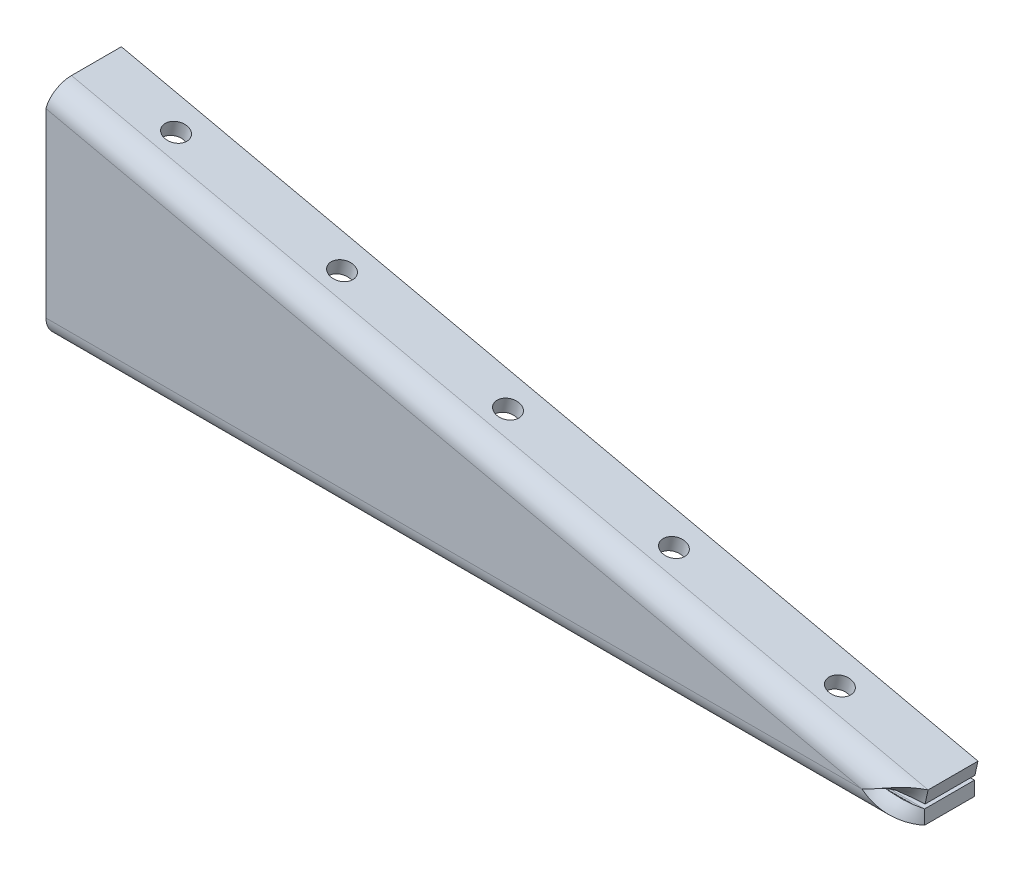
ISO-10303-21;
HEADER;
FILE_DESCRIPTION(('STEP AP214'),'2;1');
FILE_NAME('part.step','',(''),(''),'','','');
FILE_SCHEMA(('AUTOMOTIVE_DESIGN { 1 0 10303 214 1 1 1 1 }'));
ENDSEC;
DATA;
#1=APPLICATION_CONTEXT('core data for automotive mechanical design processes');
#2=APPLICATION_PROTOCOL_DEFINITION('international standard','automotive_design',2000,#1);
#3=PRODUCT_CONTEXT('',#1,'mechanical');
#4=PRODUCT('Part','Part','',(#3));
#5=PRODUCT_RELATED_PRODUCT_CATEGORY('part','',(#4));
#6=PRODUCT_DEFINITION_FORMATION('','',#4);
#7=PRODUCT_DEFINITION_CONTEXT('part definition',#1,'design');
#8=PRODUCT_DEFINITION('design','',#6,#7);
#9=PRODUCT_DEFINITION_SHAPE('','',#8);
#10=(LENGTH_UNIT() NAMED_UNIT(*) SI_UNIT(.MILLI.,.METRE.));
#11=(NAMED_UNIT(*) PLANE_ANGLE_UNIT() SI_UNIT($,.RADIAN.));
#12=(NAMED_UNIT(*) SI_UNIT($,.STERADIAN.) SOLID_ANGLE_UNIT());
#13=UNCERTAINTY_MEASURE_WITH_UNIT(LENGTH_MEASURE(1.E-05),#10,'distance_accuracy_value','');
#14=(GEOMETRIC_REPRESENTATION_CONTEXT(3) GLOBAL_UNCERTAINTY_ASSIGNED_CONTEXT((#13)) GLOBAL_UNIT_ASSIGNED_CONTEXT((#10,
#11,#12)) REPRESENTATION_CONTEXT('',''));
#15=CARTESIAN_POINT('',(0.,0.,0.));
#16=DIRECTION('',(0.,0.,1.));
#17=DIRECTION('',(1.,0.,0.));
#18=AXIS2_PLACEMENT_3D('',#15,#16,#17);
#19=CARTESIAN_POINT('',(0.,0.,-3.175));
#20=DIRECTION('',(-1.,0.,0.));
#21=DIRECTION('',(0.,0.,1.));
#22=AXIS2_PLACEMENT_3D('',#19,#20,#21);
#23=PLANE('',#22);
#24=DIRECTION('',(0.,-1.,0.));
#25=VECTOR('',#24,1.);
#26=CARTESIAN_POINT('',(0.,0.,0.));
#27=LINE('',#26,#25);
#28=CARTESIAN_POINT('',(0.,40.64,0.));
#29=VERTEX_POINT('',#28);
#30=CARTESIAN_POINT('',(0.,0.,0.));
#31=VERTEX_POINT('',#30);
#32=EDGE_CURVE('E188',#29,#31,#27,.T.);
#33=ORIENTED_EDGE('',*,*,#32,.F.);
#34=DIRECTION('',(0.,0.,1.));
#35=VECTOR('',#34,1.);
#36=CARTESIAN_POINT('',(0.,40.64,-3.175));
#37=LINE('',#36,#35);
#38=CARTESIAN_POINT('',(0.,40.6400000000002,-3.17500000000007));
#39=VERTEX_POINT('',#38);
#40=EDGE_CURVE('E87',#39,#29,#37,.T.);
#41=ORIENTED_EDGE('',*,*,#40,.F.);
#42=DIRECTION('',(0.,-1.,0.));
#43=VECTOR('',#42,1.);
#44=CARTESIAN_POINT('',(0.,0.,-3.175));
#45=LINE('',#44,#43);
#46=CARTESIAN_POINT('',(0.,0.,-3.17500000000001));
#47=VERTEX_POINT('',#46);
#48=EDGE_CURVE('E205',#39,#47,#45,.T.);
#49=ORIENTED_EDGE('',*,*,#48,.T.);
#50=DIRECTION('',(0.,0.,1.));
#51=VECTOR('',#50,1.);
#52=CARTESIAN_POINT('',(0.,0.,-3.175));
#53=LINE('',#52,#51);
#54=EDGE_CURVE('E13',#47,#31,#53,.T.);
#55=ORIENTED_EDGE('',*,*,#54,.T.);
#56=EDGE_LOOP('',(#33,#41,#49,#55));
#57=FACE_BOUND('',#56,.T.);
#58=ADVANCED_FACE('F79',(#57),#23,.T.);
#59=CARTESIAN_POINT('',(0.,0.,-3.175));
#60=DIRECTION('',(0.,0.,-1.));
#61=DIRECTION('',(-1.,0.,0.));
#62=AXIS2_PLACEMENT_3D('',#59,#60,#61);
#63=PLANE('',#62);
#64=DIRECTION('',(1.,0.,0.));
#65=VECTOR('',#64,1.);
#66=CARTESIAN_POINT('',(182.88,0.,-3.175));
#67=LINE('',#66,#65);
#68=CARTESIAN_POINT('',(182.88,0.,-3.17500000000001));
#69=VERTEX_POINT('',#68);
#70=EDGE_CURVE('E176',#47,#69,#67,.T.);
#71=ORIENTED_EDGE('',*,*,#70,.F.);
#72=ORIENTED_EDGE('',*,*,#48,.F.);
#73=DIRECTION('',(-0.976187060183953,0.216930457818656,0.));
#74=VECTOR('',#73,1.);
#75=CARTESIAN_POINT('',(0.,40.64,-3.175));
#76=LINE('',#75,#74);
#77=EDGE_CURVE('E187',#69,#39,#76,.T.);
#78=ORIENTED_EDGE('',*,*,#77,.F.);
#79=EDGE_LOOP('',(#71,#72,#78));
#80=FACE_BOUND('',#79,.T.);
#81=ADVANCED_FACE('F210',(#80),#63,.T.);
#82=CARTESIAN_POINT('',(0.,0.,0.));
#83=DIRECTION('',(0.,0.,-1.));
#84=DIRECTION('',(-1.,0.,0.));
#85=AXIS2_PLACEMENT_3D('',#82,#83,#84);
#86=PLANE('',#85);
#87=DIRECTION('',(1.,0.,0.));
#88=VECTOR('',#87,1.);
#89=CARTESIAN_POINT('',(182.88,0.,0.));
#90=LINE('',#89,#88);
#91=CARTESIAN_POINT('',(182.88,1.88983328422239E-13,-1.18930767162357E-13));
#92=VERTEX_POINT('',#91);
#93=EDGE_CURVE('E158',#31,#92,#90,.T.);
#94=ORIENTED_EDGE('',*,*,#93,.T.);
#95=DIRECTION('',(-0.976187060183953,0.216930457818656,0.));
#96=VECTOR('',#95,1.);
#97=CARTESIAN_POINT('',(0.,40.64,0.));
#98=LINE('',#97,#96);
#99=EDGE_CURVE('E215',#92,#29,#98,.T.);
#100=ORIENTED_EDGE('',*,*,#99,.T.);
#101=ORIENTED_EDGE('',*,*,#32,.T.);
#102=EDGE_LOOP('',(#94,#100,#101));
#103=FACE_BOUND('',#102,.T.);
#104=ADVANCED_FACE('F224',(#103),#86,.F.);
#105=CARTESIAN_POINT('',(0.,40.6400000000001,-4.69899999999999));
#106=DIRECTION('',(-0.976187060183953,0.216930457818657,0.));
#107=DIRECTION('',(-0.216930457818657,-0.976187060183953,0.));
#108=AXIS2_PLACEMENT_3D('',#105,#106,#107);
#109=PLANE('',#108);
#110=DIRECTION('',(-0.216930457818656,-0.976187060183953,0.));
#111=VECTOR('',#110,1.);
#112=CARTESIAN_POINT('',(1.01935622128986,45.2271029958044,-4.69899999999998));
#113=LINE('',#112,#111);
#114=CARTESIAN_POINT('',(0.330602017715675,42.1277090797204,-4.69899999999998));
#115=VERTEX_POINT('',#114);
#116=CARTESIAN_POINT('',(1.01935622128991,45.2271029958044,-4.69899999999997));
#117=VERTEX_POINT('',#116);
#118=EDGE_CURVE('E125',#115,#117,#113,.F.);
#119=ORIENTED_EDGE('',*,*,#118,.F.);
#120=CARTESIAN_POINT('',(0.,40.6400000000001,-4.69899999999999));
#121=DIRECTION('',(0.976187060183953,-0.216930457818657,0.));
#122=DIRECTION('',(0.216930457818657,0.976187060183953,0.));
#123=AXIS2_PLACEMENT_3D('',#120,#121,#122);
#124=CIRCLE('',#123,1.52399999999991);
#125=EDGE_CURVE('E207',#39,#115,#124,.F.);
#126=ORIENTED_EDGE('',*,*,#125,.F.);
#127=ORIENTED_EDGE('',*,*,#40,.T.);
#128=CARTESIAN_POINT('',(0.,40.6400000000001,-4.69899999999999));
#129=DIRECTION('',(0.976187060183953,-0.216930457818657,0.));
#130=DIRECTION('',(0.216930457818657,0.976187060183953,0.));
#131=AXIS2_PLACEMENT_3D('',#128,#129,#130);
#132=CIRCLE('',#131,4.69899999999991);
#133=EDGE_CURVE('E95',#29,#117,#132,.F.);
#134=ORIENTED_EDGE('',*,*,#133,.T.);
#135=EDGE_LOOP('',(#119,#126,#127,#134));
#136=FACE_BOUND('',#135,.T.);
#137=ADVANCED_FACE('F220',(#136),#109,.T.);
#138=CARTESIAN_POINT('',(192.985804399912,2.6004167935014,-4.69899999999997));
#139=CARTESIAN_POINT('',(192.229121189796,2.7685686179717,-4.07970301282514));
#140=CARTESIAN_POINT('',(191.445833915569,2.81650011497527,-3.46073619606739));
#141=CARTESIAN_POINT('',(189.829758255918,2.69011014756389,-2.31650450861049));
#142=CARTESIAN_POINT('',(188.997063481091,2.51595891135178,-1.79173310447883));
#143=CARTESIAN_POINT('',(187.293825003891,1.99733626496586,-0.915976085325001));
#144=CARTESIAN_POINT('',(186.423356049894,1.65320122248662,-0.56533504329329));
#145=CARTESIAN_POINT('',(184.661877239985,0.872497078916047,-0.0913787598515469));
#146=CARTESIAN_POINT('',(183.77102758907,0.436397880820885,0.031749999999844));
#147=CARTESIAN_POINT('',(182.88,1.89550612082388E-13,0.0317499999998803));
#148=CARTESIAN_POINT('',(192.978916857876,2.56942285434056,-4.69899999999997));
#149=CARTESIAN_POINT('',(192.222234090152,2.73757458050145,-4.08385948430097));
#150=CARTESIAN_POINT('',(191.439125637817,2.78631286509029,-3.4690466913958));
#151=CARTESIAN_POINT('',(189.823740015438,2.66302806540367,-2.33249441123727));
#152=CARTESIAN_POINT('',(188.9915557421,2.49117408588955,-1.81124496283803));
#153=CARTESIAN_POINT('',(187.289592287524,1.97828904131546,-0.941365507571142));
#154=CARTESIAN_POINT('',(186.419887352996,1.63759208644876,-0.593077761123537));
#155=CARTESIAN_POINT('',(184.660074440429,0.864384480912735,-0.122302392335765));
#156=CARTESIAN_POINT('',(183.770125481418,0.432340485459562,-1.55759036924761E-13));
#157=CARTESIAN_POINT('',(182.88,1.87671328316746E-13,-1.196959198424E-13));
#158=CARTESIAN_POINT('',(192.290162654302,-0.529971061743492,-4.69900000000002));
#159=CARTESIAN_POINT('',(191.533524125812,-0.361829166523568,-4.49950663188416));
#160=CARTESIAN_POINT('',(190.768297862595,-0.232412123407579,-4.30009622423651));
#161=CARTESIAN_POINT('',(189.221915967433,-0.0451801506185887,-3.93148467391484));
#162=CARTESIAN_POINT('',(188.440781842939,0.0126915396664578,-3.76243079875834));
#163=CARTESIAN_POINT('',(186.866320650849,0.0735666762757365,-3.48030773218531));
#164=CARTESIAN_POINT('',(186.073017663266,0.0766784826626479,-3.36734954414825));
#165=CARTESIAN_POINT('',(184.4797944848,0.0531246805815714,-3.21466564075763));
#166=CARTESIAN_POINT('',(183.679914716167,0.0266009493272822,-3.17500000000013));
#167=CARTESIAN_POINT('',(182.88,0.,-3.17500000000012));
#168=CARTESIAN_POINT('',(192.283206236846,-0.561274940295941,-4.69900000000002));
#169=CARTESIAN_POINT('',(191.526568155173,-0.39313314436852,-4.50370466807475));
#170=CARTESIAN_POINT('',(190.761522502065,-0.262901245791408,-4.30848982451821));
#171=CARTESIAN_POINT('',(189.215837544548,-0.0725330536004135,-3.94763447556789));
#172=CARTESIAN_POINT('',(188.435219026558,-0.0123411340503954,-3.78213777570114));
#173=CARTESIAN_POINT('',(186.862045607318,0.0543289803888353,-3.50595104865391));
#174=CARTESIAN_POINT('',(186.0695142794,0.0609132552644082,-3.3953696891568));
#175=CARTESIAN_POINT('',(184.477973657248,0.0449309565982266,-3.24589850956669));
#176=CARTESIAN_POINT('',(183.679003587438,0.0225029800123461,-3.20706750000013));
#177=CARTESIAN_POINT('',(182.88,0.,-3.20706750000012));
#178=B_SPLINE_SURFACE_WITH_KNOTS('',1,3,((#138,#139,#140,#141,#142,#143,#144,#145,#146,#147),
(#148,#149,#150,#151,#152,#153,#154,#155,#156,#157),(#158,#159,#160,#161,#162,#163,#164,#165,
#166,#167),(#168,#169,#170,#171,#172,#173,#174,#175,#176,#177)),.UNSPECIFIED.,.F.,.F.,.F.,(2,1,
1,2),(4,2,2,2,4),(-0.01,0.,1.,1.0101),(0.,0.25,0.5,0.75,1.),.UNSPECIFIED.);
#179=CARTESIAN_POINT('',(192.290162654302,-0.529971061743492,-4.69900000000002));
#180=CARTESIAN_POINT('',(192.049366426872,-0.476437271022111,-4.63551478110857));
#181=CARTESIAN_POINT('',(191.807701612998,-0.42681999215049,-4.57202802308309));
#182=CARTESIAN_POINT('',(191.322672146572,-0.335262442598152,-4.44604003774014));
#183=CARTESIAN_POINT('',(191.079307529192,-0.293322013548503,-4.38353879011648));
#184=CARTESIAN_POINT('',(190.59101856498,-0.216977575002203,-4.26053612667143));
#185=CARTESIAN_POINT('',(190.346094989904,-0.182570095917205,-4.2000338011193));
#186=CARTESIAN_POINT('',(189.85464566939,-0.120962283921681,-4.08193563772876));
#187=CARTESIAN_POINT('',(189.608119918306,-0.0937619764242041,-4.02433981013946));
#188=CARTESIAN_POINT('',(189.098052897696,-0.0446747231492071,-3.90945436898322));
#189=CARTESIAN_POINT('',(188.834413819381,-0.0232277946702167,-3.85241032676306));
#190=CARTESIAN_POINT('',(188.305547664036,0.0126117999617425,-3.74362419762509));
#191=CARTESIAN_POINT('',(188.040320473225,0.0270039544025378,-3.69188249552334));
#192=CARTESIAN_POINT('',(187.50845460038,0.0494779929350258,-3.59460943783821));
#193=CARTESIAN_POINT('',(187.241815873444,0.057559675054364,-3.54907828106741));
#194=CARTESIAN_POINT('',(186.707345605774,0.0682613505656633,-3.46502772542344));
#195=CARTESIAN_POINT('',(186.43951414906,0.0708817227579301,-3.42650784041268));
#196=CARTESIAN_POINT('',(185.898400252216,0.0716342364240752,-3.35658813565648));
#197=CARTESIAN_POINT('',(185.625101071065,0.0696912288581337,-3.32531698098039));
#198=CARTESIAN_POINT('',(185.077708648348,0.062242035714764,-3.27128821046229));
#199=CARTESIAN_POINT('',(184.803615400099,0.0567358200629206,-3.24853066647995));
#200=CARTESIAN_POINT('',(184.254739575791,0.0432983859087885,-3.21194223533375));
#201=CARTESIAN_POINT('',(183.979956700609,0.0353658170892231,-3.19811633218568));
#202=CARTESIAN_POINT('',(183.430116471854,0.0182887732553086,-3.17962955577701));
#203=CARTESIAN_POINT('',(183.155059114113,0.00914427955050532,-3.17496882388037));
#204=CARTESIAN_POINT('',(182.88,0.,-3.17500000000012));
#205=B_SPLINE_CURVE_WITH_KNOTS('',3,(#179,#180,#181,#182,#183,#184,#185,#186,#187,#188,#189,
#190,#191,#192,#193,#194,#195,#196,#197,#198,#199,#200,#201,#202,#203,#204),.UNSPECIFIED.,.F.,
.F.,(4,2,2,2,2,2,2,2,2,2,2,2,4),(0.,0.764108013834028,1.52820026278874,2.29193983595674,
3.05568210209409,3.86730551245854,4.67898778454466,5.49069603418878,6.30234798130269,
7.12745957363129,7.95257813020998,8.77815672093244,9.60374804531104),.UNSPECIFIED.);
#206=CARTESIAN_POINT('',(192.290162654302,-0.529971061743492,-4.69900000000003));
#207=VERTEX_POINT('',#206);
#208=EDGE_CURVE('E202',#207,#69,#205,.T.);
#209=DIRECTION('',(-0.216930457818656,-0.976187060183953,0.));
#210=VECTOR('',#209,1.);
#211=CARTESIAN_POINT('',(192.290162654302,-0.529971061743309,-4.69900000000002));
#212=LINE('',#211,#210);
#213=CARTESIAN_POINT('',(192.978916857876,2.56942285434075,-4.69900000000001));
#214=VERTEX_POINT('',#213);
#215=EDGE_CURVE('E233',#207,#214,#212,.F.);
#216=CARTESIAN_POINT('',(192.978916857876,2.56942285434056,-4.69899999999997));
#217=CARTESIAN_POINT('',(192.803778102758,2.60836213453007,-4.55662526144173));
#218=CARTESIAN_POINT('',(192.627229628719,2.64094781129493,-4.41425081592887));
#219=CARTESIAN_POINT('',(192.271363356149,2.69354191386425,-4.13068860663579));
#220=CARTESIAN_POINT('',(192.092045892854,2.71355185014911,-3.98950070234995));
#221=CARTESIAN_POINT('',(191.730657192682,2.7411331445314,-3.70946873745796));
#222=CARTESIAN_POINT('',(191.548586070893,2.7487050210349,-3.57062457940551));
#223=CARTESIAN_POINT('',(191.182350431555,2.75167731578617,-3.29689319249042));
#224=CARTESIAN_POINT('',(190.99819502184,2.74711861228578,-3.16199421897095));
#225=CARTESIAN_POINT('',(190.627283288722,2.72626690755505,-2.89676809778283));
#226=CARTESIAN_POINT('',(190.440527046642,2.70997427242208,-2.76644080761121));
#227=CARTESIAN_POINT('',(190.064512333277,2.66610725877461,-2.51142511152772));
#228=CARTESIAN_POINT('',(189.875253914289,2.63853311569391,-2.38673658800073));
#229=CARTESIAN_POINT('',(189.493616818633,2.57251359571346,-2.14354177876733));
#230=CARTESIAN_POINT('',(189.301228886511,2.53402646627823,-2.02506134870796));
#231=CARTESIAN_POINT('',(188.914176783548,2.44687415495541,-1.79579221113279));
#232=CARTESIAN_POINT('',(188.719512512561,2.39820852367157,-1.68500384352094));
#233=CARTESIAN_POINT('',(188.328075791177,2.29141816566433,-1.47203040297164));
#234=CARTESIAN_POINT('',(188.131303278583,2.23329315915912,-1.36984558463876));
#235=CARTESIAN_POINT('',(187.735892483947,2.1084060266791,-1.17495620287769));
#236=CARTESIAN_POINT('',(187.537254775411,2.04164647986729,-1.08224882325626));
#237=CARTESIAN_POINT('',(187.13826343687,1.90034214820781,-0.907042558976074));
#238=CARTESIAN_POINT('',(186.937909863875,1.82579762109874,-0.824543336551664));
#239=CARTESIAN_POINT('',(186.535699844893,1.66987656461839,-0.670446906251846));
#240=CARTESIAN_POINT('',(186.333843569924,1.58850080218278,-0.598848477088422));
#241=CARTESIAN_POINT('',(185.952969538076,1.42995871780771,-0.47498438404325));
#242=CARTESIAN_POINT('',(185.77409656302,1.35344628666614,-0.42143165781804));
#243=CARTESIAN_POINT('',(185.415511705514,1.19659899218178,-0.323575890166449));
#244=CARTESIAN_POINT('',(185.235799884095,1.11626440313681,-0.27927218620815));
#245=CARTESIAN_POINT('',(184.875695169284,0.952503906747726,-0.200195982052507));
#246=CARTESIAN_POINT('',(184.695302291853,0.869078071447212,-0.165423259887536));
#247=CARTESIAN_POINT('',(184.333564974486,0.699678854574789,-0.105557112030828));
#248=CARTESIAN_POINT('',(184.152219289233,0.613699823411884,-0.08048719039621));
#249=CARTESIAN_POINT('',(183.789163740078,0.440166993078012,-0.0403116489877436));
#250=CARTESIAN_POINT('',(183.607453853539,0.352613093149813,-0.02520666909871));
#251=CARTESIAN_POINT('',(183.243829576222,0.176706468015943,-0.00504435672705152));
#252=CARTESIAN_POINT('',(183.061915158694,0.0883536241243205,1.14574400644556E-05));
#253=CARTESIAN_POINT('',(182.88,1.87671328316746E-13,-1.196959198424E-13));
#254=B_SPLINE_CURVE_WITH_KNOTS('',3,(#216,#217,#218,#219,#220,#221,#222,#223,#224,#225,#226,
#227,#228,#229,#230,#231,#232,#233,#234,#235,#236,#237,#238,#239,#240,#241,#242,#243,#244,#245,
#246,#247,#248,#249,#250,#251,#252,#253),.UNSPECIFIED.,.F.,.F.,(4,2,2,2,2,2,2,2,2,2,2,2,2,2,2,2,
2,2,4),(0.,0.687032648661464,1.37398276160367,2.060904242416,2.74551383386202,3.43010206648934,
4.11467601317338,4.80190528844134,5.48916491232741,6.17644486712254,6.8635200014225,
7.55057239582179,8.23754775846006,8.84266202014231,9.44773292100583,10.0527897291381,
10.6593031873384,11.2658555881634,11.8724996252455),.UNSPECIFIED.);
#255=EDGE_CURVE('E204',#214,#92,#254,.T.);
#256=DIRECTION('',(0.,0.,1.));
#257=VECTOR('',#256,1.);
#258=CARTESIAN_POINT('',(182.88,0.,-3.175));
#259=LINE('',#258,#257);
#260=EDGE_CURVE('E82',#69,#92,#259,.T.);
#261=ORIENTED_EDGE('',*,*,#208,.F.);
#262=ORIENTED_EDGE('',*,*,#215,.T.);
#263=ORIENTED_EDGE('',*,*,#255,.T.);
#264=ORIENTED_EDGE('',*,*,#260,.F.);
#265=EDGE_LOOP('',(#261,#262,#263,#264));
#266=FACE_BOUND('',#265,.T.);
#267=ADVANCED_FACE('F200',(#266),#178,.F.);
#268=CARTESIAN_POINT('',(191.959560636586,-2.01768014146375,-4.69900000000004));
#269=DIRECTION('',(0.976187060183953,-0.216930457818657,0.));
#270=DIRECTION('',(0.216930457818657,0.976187060183953,0.));
#271=AXIS2_PLACEMENT_3D('',#268,#269,#270);
#272=CYLINDRICAL_SURFACE('',#271,4.69899999999991);
#273=ORIENTED_EDGE('',*,*,#99,.F.);
#274=ORIENTED_EDGE('',*,*,#255,.F.);
#275=DIRECTION('',(0.976187060183953,-0.216930457818656,0.));
#276=VECTOR('',#275,1.);
#277=CARTESIAN_POINT('',(1.01935622128986,45.2271029958044,-4.69899999999998));
#278=LINE('',#277,#276);
#279=EDGE_CURVE('E686',#214,#117,#278,.F.);
#280=ORIENTED_EDGE('',*,*,#279,.T.);
#281=ORIENTED_EDGE('',*,*,#133,.F.);
#282=EDGE_LOOP('',(#273,#274,#280,#281));
#283=FACE_BOUND('',#282,.T.);
#284=ADVANCED_FACE('F282',(#283),#272,.T.);
#285=CARTESIAN_POINT('',(191.959560636586,-2.01768014146375,-4.69900000000004));
#286=DIRECTION('',(0.976187060183953,-0.216930457818657,0.));
#287=DIRECTION('',(0.216930457818657,0.976187060183953,0.));
#288=AXIS2_PLACEMENT_3D('',#285,#286,#287);
#289=CYLINDRICAL_SURFACE('',#288,1.52399999999991);
#290=ORIENTED_EDGE('',*,*,#77,.T.);
#291=ORIENTED_EDGE('',*,*,#125,.T.);
#292=DIRECTION('',(0.976187060183953,-0.216930457818656,0.));
#293=VECTOR('',#292,1.);
#294=CARTESIAN_POINT('',(0.330602017715632,42.1277090797204,-4.69899999999999));
#295=LINE('',#294,#293);
#296=EDGE_CURVE('E117',#115,#207,#295,.T.);
#297=ORIENTED_EDGE('',*,*,#296,.T.);
#298=ORIENTED_EDGE('',*,*,#208,.T.);
#299=EDGE_LOOP('',(#290,#291,#297,#298));
#300=FACE_BOUND('',#299,.T.);
#301=ADVANCED_FACE('F206',(#300),#289,.F.);
#302=CARTESIAN_POINT('',(1.01935622128986,45.2271029958044,-3.17499999999999));
#303=DIRECTION('',(0.976187060183953,-0.216930457818656,0.));
#304=DIRECTION('',(0.216930457818656,0.976187060183953,0.));
#305=AXIS2_PLACEMENT_3D('',#302,#303,#304);
#306=PLANE('',#305);
#307=ORIENTED_EDGE('',*,*,#118,.T.);
#308=DIRECTION('',(0.,0.,1.));
#309=VECTOR('',#308,1.);
#310=CARTESIAN_POINT('',(1.01935622128986,45.2271029958044,1.38303950425521E-13));
#311=LINE('',#310,#309);
#312=CARTESIAN_POINT('',(1.01935622128987,45.2271029958044,-15.875));
#313=VERTEX_POINT('',#312);
#314=EDGE_CURVE('E690',#313,#117,#311,.T.);
#315=ORIENTED_EDGE('',*,*,#314,.F.);
#316=DIRECTION('',(-0.216930457818656,-0.976187060183953,0.));
#317=VECTOR('',#316,1.);
#318=CARTESIAN_POINT('',(1.01935622128987,45.2271029958044,-15.875));
#319=LINE('',#318,#317);
#320=CARTESIAN_POINT('',(0.330602017715641,42.1277090797204,-15.875));
#321=VERTEX_POINT('',#320);
#322=EDGE_CURVE('E208',#313,#321,#319,.T.);
#323=ORIENTED_EDGE('',*,*,#322,.T.);
#324=DIRECTION('',(0.,0.,-1.));
#325=VECTOR('',#324,1.);
#326=CARTESIAN_POINT('',(0.330602017715632,42.1277090797204,-3.175));
#327=LINE('',#326,#325);
#328=EDGE_CURVE('E704',#321,#115,#327,.F.);
#329=ORIENTED_EDGE('',*,*,#328,.T.);
#330=EDGE_LOOP('',(#307,#315,#323,#329));
#331=FACE_BOUND('',#330,.T.);
#332=ADVANCED_FACE('F303',(#331),#306,.F.);
#333=CARTESIAN_POINT('',(9.62547386834869,43.3146324075691,1.38042721478551E-13));
#334=DIRECTION('',(-0.216930457818656,-0.976187060183953,0.));
#335=DIRECTION('',(0.976187060183953,-0.216930457818656,0.));
#336=AXIS2_PLACEMENT_3D('',#333,#334,#335);
#337=PLANE('',#336);
#338=CARTESIAN_POINT('',(19.6157197177942,41.094577774359,-9.52500000000007));
#339=DIRECTION('',(0.216930457818656,0.976187060183953,0.));
#340=DIRECTION('',(-0.976187060183953,0.216930457818656,0.));
#341=AXIS2_PLACEMENT_3D('',#338,#339,#340);
#342=CIRCLE('',#341,2.47649999999999);
#343=CARTESIAN_POINT('',(17.1981924632486,41.6318060531469,-9.52500000000007));
#344=VERTEX_POINT('',#343);
#345=EDGE_CURVE('E612',#344,#344,#342,.T.);
#346=ORIENTED_EDGE('',*,*,#345,.F.);
#347=EDGE_LOOP('',(#346));
#348=FACE_BOUND('',#347,.T.);
#349=CARTESIAN_POINT('',(56.8084467108028,32.8295273314682,-9.5250000000001));
#350=DIRECTION('',(0.216930457818656,0.976187060183953,0.));
#351=DIRECTION('',(-0.976187060183953,0.216930457818656,0.));
#352=AXIS2_PLACEMENT_3D('',#349,#350,#351);
#353=CIRCLE('',#352,2.47649999999999);
#354=CARTESIAN_POINT('',(54.3909194562572,33.3667556102561,-9.5250000000001));
#355=VERTEX_POINT('',#354);
#356=EDGE_CURVE('E614',#355,#355,#353,.T.);
#357=ORIENTED_EDGE('',*,*,#356,.F.);
#358=EDGE_LOOP('',(#357));
#359=FACE_BOUND('',#358,.T.);
#360=CARTESIAN_POINT('',(94.0011737038114,24.5644768885774,-9.52500000000012));
#361=DIRECTION('',(0.216930457818656,0.976187060183953,0.));
#362=DIRECTION('',(-0.976187060183953,0.216930457818656,0.));
#363=AXIS2_PLACEMENT_3D('',#360,#361,#362);
#364=CIRCLE('',#363,2.47649999999999);
#365=CARTESIAN_POINT('',(91.5836464492658,25.1017051673653,-9.52500000000012));
#366=VERTEX_POINT('',#365);
#367=EDGE_CURVE('E622',#366,#366,#364,.T.);
#368=ORIENTED_EDGE('',*,*,#367,.F.);
#369=EDGE_LOOP('',(#368));
#370=FACE_BOUND('',#369,.T.);
#371=CARTESIAN_POINT('',(131.19390069682,16.2994264456866,-9.52500000000015));
#372=DIRECTION('',(0.216930457818656,0.976187060183953,0.));
#373=DIRECTION('',(-0.976187060183953,0.216930457818656,0.));
#374=AXIS2_PLACEMENT_3D('',#371,#372,#373);
#375=CIRCLE('',#374,2.47649999999999);
#376=CARTESIAN_POINT('',(128.776373442274,16.8366547244745,-9.52500000000015));
#377=VERTEX_POINT('',#376);
#378=EDGE_CURVE('E628',#377,#377,#375,.T.);
#379=ORIENTED_EDGE('',*,*,#378,.F.);
#380=EDGE_LOOP('',(#379));
#381=FACE_BOUND('',#380,.T.);
#382=CARTESIAN_POINT('',(168.386627689829,8.03437600279583,-9.52500000000018));
#383=DIRECTION('',(0.216930457818656,0.976187060183953,0.));
#384=DIRECTION('',(-0.976187060183953,0.216930457818656,0.));
#385=AXIS2_PLACEMENT_3D('',#382,#383,#384);
#386=CIRCLE('',#385,2.47649999999999);
#387=CARTESIAN_POINT('',(165.969100435283,8.57160428158373,-9.52500000000018));
#388=VERTEX_POINT('',#387);
#389=EDGE_CURVE('E634',#388,#388,#386,.T.);
#390=ORIENTED_EDGE('',*,*,#389,.F.);
#391=EDGE_LOOP('',(#390));
#392=FACE_BOUND('',#391,.T.);
#393=ORIENTED_EDGE('',*,*,#279,.F.);
#394=DIRECTION('',(0.,0.,-1.));
#395=VECTOR('',#394,1.);
#396=CARTESIAN_POINT('',(192.978916857876,2.56942285434074,0.));
#397=LINE('',#396,#395);
#398=CARTESIAN_POINT('',(192.978916857876,2.56942285434079,-15.875));
#399=VERTEX_POINT('',#398);
#400=EDGE_CURVE('E688',#214,#399,#397,.T.);
#401=ORIENTED_EDGE('',*,*,#400,.T.);
#402=DIRECTION('',(-0.976187060183953,0.216930457818656,0.));
#403=VECTOR('',#402,1.);
#404=CARTESIAN_POINT('',(9.6254738683487,43.3146324075691,-15.875));
#405=LINE('',#404,#403);
#406=EDGE_CURVE('E133',#399,#313,#405,.T.);
#407=ORIENTED_EDGE('',*,*,#406,.T.);
#408=ORIENTED_EDGE('',*,*,#314,.T.);
#409=EDGE_LOOP('',(#393,#401,#407,#408));
#410=FACE_BOUND('',#409,.T.);
#411=ADVANCED_FACE('F315',(#348,#359,#370,#381,#392,#410),#337,.F.);
#412=CARTESIAN_POINT('',(8.93671966477446,40.2152384914851,1.26957268227724E-13));
#413=DIRECTION('',(-0.216930457818656,-0.976187060183953,0.));
#414=DIRECTION('',(0.976187060183953,-0.216930457818656,0.));
#415=AXIS2_PLACEMENT_3D('',#412,#413,#414);
#416=PLANE('',#415);
#417=CARTESIAN_POINT('',(18.9269655142199,37.995183858275,-9.52500000000007));
#418=DIRECTION('',(0.216930457818656,0.976187060183953,0.));
#419=DIRECTION('',(-0.976187060183953,0.216930457818656,0.));
#420=AXIS2_PLACEMENT_3D('',#417,#418,#419);
#421=CIRCLE('',#420,2.47649999999999);
#422=CARTESIAN_POINT('',(16.5094382596744,38.5324121370629,-9.52500000000007));
#423=VERTEX_POINT('',#422);
#424=EDGE_CURVE('E609',#423,#423,#421,.T.);
#425=ORIENTED_EDGE('',*,*,#424,.T.);
#426=EDGE_LOOP('',(#425));
#427=FACE_BOUND('',#426,.T.);
#428=CARTESIAN_POINT('',(56.1196925072285,29.7301334153842,-9.5250000000001));
#429=DIRECTION('',(0.216930457818656,0.976187060183953,0.));
#430=DIRECTION('',(-0.976187060183953,0.216930457818656,0.));
#431=AXIS2_PLACEMENT_3D('',#428,#429,#430);
#432=CIRCLE('',#431,2.47649999999999);
#433=CARTESIAN_POINT('',(53.702165252683,30.2673616941721,-9.5250000000001));
#434=VERTEX_POINT('',#433);
#435=EDGE_CURVE('E619',#434,#434,#432,.T.);
#436=ORIENTED_EDGE('',*,*,#435,.T.);
#437=EDGE_LOOP('',(#436));
#438=FACE_BOUND('',#437,.T.);
#439=CARTESIAN_POINT('',(93.3124195002372,21.4650829724934,-9.52500000000012));
#440=DIRECTION('',(0.216930457818656,0.976187060183953,0.));
#441=DIRECTION('',(-0.976187060183953,0.216930457818656,0.));
#442=AXIS2_PLACEMENT_3D('',#439,#440,#441);
#443=CIRCLE('',#442,2.47649999999999);
#444=CARTESIAN_POINT('',(90.8948922456916,22.0023112512813,-9.52500000000012));
#445=VERTEX_POINT('',#444);
#446=EDGE_CURVE('E625',#445,#445,#443,.T.);
#447=ORIENTED_EDGE('',*,*,#446,.T.);
#448=EDGE_LOOP('',(#447));
#449=FACE_BOUND('',#448,.T.);
#450=CARTESIAN_POINT('',(130.505146493246,13.2000325296026,-9.52500000000015));
#451=DIRECTION('',(0.216930457818656,0.976187060183953,0.));
#452=DIRECTION('',(-0.976187060183953,0.216930457818656,0.));
#453=AXIS2_PLACEMENT_3D('',#450,#451,#452);
#454=CIRCLE('',#453,2.47649999999999);
#455=CARTESIAN_POINT('',(128.0876192387,13.7372608083905,-9.52500000000015));
#456=VERTEX_POINT('',#455);
#457=EDGE_CURVE('E631',#456,#456,#454,.T.);
#458=ORIENTED_EDGE('',*,*,#457,.T.);
#459=EDGE_LOOP('',(#458));
#460=FACE_BOUND('',#459,.T.);
#461=CARTESIAN_POINT('',(167.697873486254,4.93498208671178,-9.52500000000018));
#462=DIRECTION('',(0.216930457818656,0.976187060183953,0.));
#463=DIRECTION('',(-0.976187060183953,0.216930457818656,0.));
#464=AXIS2_PLACEMENT_3D('',#461,#462,#463);
#465=CIRCLE('',#464,2.47649999999999);
#466=CARTESIAN_POINT('',(165.280346231709,5.47221036549968,-9.52500000000018));
#467=VERTEX_POINT('',#466);
#468=EDGE_CURVE('E637',#467,#467,#465,.T.);
#469=ORIENTED_EDGE('',*,*,#468,.T.);
#470=EDGE_LOOP('',(#469));
#471=FACE_BOUND('',#470,.T.);
#472=DIRECTION('',(0.976187060183953,-0.216930457818656,0.));
#473=VECTOR('',#472,1.);
#474=CARTESIAN_POINT('',(0.330602017715641,42.1277090797204,-15.875));
#475=LINE('',#474,#473);
#476=CARTESIAN_POINT('',(192.290162654302,-0.529971061743266,-15.875));
#477=VERTEX_POINT('',#476);
#478=EDGE_CURVE('E152',#477,#321,#475,.F.);
#479=ORIENTED_EDGE('',*,*,#478,.F.);
#480=DIRECTION('',(0.,0.,1.));
#481=VECTOR('',#480,1.);
#482=CARTESIAN_POINT('',(192.290162654302,-0.529971061743263,-15.875));
#483=LINE('',#482,#481);
#484=EDGE_CURVE('E697',#207,#477,#483,.F.);
#485=ORIENTED_EDGE('',*,*,#484,.F.);
#486=ORIENTED_EDGE('',*,*,#296,.F.);
#487=ORIENTED_EDGE('',*,*,#328,.F.);
#488=EDGE_LOOP('',(#479,#485,#486,#487));
#489=FACE_BOUND('',#488,.T.);
#490=ADVANCED_FACE('F311',(#427,#438,#449,#460,#471,#489),#416,.T.);
#491=CARTESIAN_POINT('',(1.01935622128987,45.2271029958044,-15.875));
#492=DIRECTION('',(0.,0.,1.));
#493=DIRECTION('',(0.,-1.,0.));
#494=AXIS2_PLACEMENT_3D('',#491,#492,#493);
#495=PLANE('',#494);
#496=ORIENTED_EDGE('',*,*,#478,.T.);
#497=ORIENTED_EDGE('',*,*,#322,.F.);
#498=ORIENTED_EDGE('',*,*,#406,.F.);
#499=DIRECTION('',(-0.216930457818656,-0.976187060183953,0.));
#500=VECTOR('',#499,1.);
#501=CARTESIAN_POINT('',(192.978916857876,2.56942285434078,-15.875));
#502=LINE('',#501,#500);
#503=EDGE_CURVE('E694',#399,#477,#502,.T.);
#504=ORIENTED_EDGE('',*,*,#503,.T.);
#505=EDGE_LOOP('',(#496,#497,#498,#504));
#506=FACE_BOUND('',#505,.T.);
#507=ADVANCED_FACE('F307',(#506),#495,.F.);
#508=CARTESIAN_POINT('',(192.978916857876,2.56942285434077,-15.875));
#509=DIRECTION('',(-0.976187060183953,0.216930457818656,0.));
#510=DIRECTION('',(-0.216930457818656,-0.976187060183953,0.));
#511=AXIS2_PLACEMENT_3D('',#508,#509,#510);
#512=PLANE('',#511);
#513=ORIENTED_EDGE('',*,*,#215,.F.);
#514=ORIENTED_EDGE('',*,*,#484,.T.);
#515=ORIENTED_EDGE('',*,*,#503,.F.);
#516=ORIENTED_EDGE('',*,*,#400,.F.);
#517=EDGE_LOOP('',(#513,#514,#515,#516));
#518=FACE_BOUND('',#517,.T.);
#519=ADVANCED_FACE('F310',(#518),#512,.F.);
#520=CARTESIAN_POINT('',(182.88,0.,0.0317499999999931));
#521=CARTESIAN_POINT('',(183.655141610639,-0.619296987174863,0.0317499999999955));
#522=CARTESIAN_POINT('',(184.430174313735,-1.23826380393265,-0.0913787598513678));
#523=CARTESIAN_POINT('',(185.98034862747,-2.38249549138962,-0.565335043293091));
#524=CARTESIAN_POINT('',(186.755435784337,-2.90726689552132,-0.915976085324803));
#525=CARTESIAN_POINT('',(188.305610098072,-3.78302391467518,-1.79173310447866));
#526=CARTESIAN_POINT('',(189.08069725494,-4.1336649567069,-2.31650450861036));
#527=CARTESIAN_POINT('',(190.630871568675,-4.60762124014863,-3.46073619606732));
#528=CARTESIAN_POINT('',(191.40590427177,-4.73075,-4.07970301282503));
#529=CARTESIAN_POINT('',(192.18104588241,-4.73075,-4.69899999999998));
#530=CARTESIAN_POINT('',(182.88,0.,0.));
#531=CARTESIAN_POINT('',(183.655141157455,-0.615140515699032,0.));
#532=CARTESIAN_POINT('',(184.430174313735,-1.22995330860424,-0.122302392335587));
#533=CARTESIAN_POINT('',(185.98034862747,-2.36650558876284,-0.593077761123339));
#534=CARTESIAN_POINT('',(186.755435784337,-2.88775503716211,-0.941365507570946));
#535=CARTESIAN_POINT('',(188.305610098072,-3.75763449242904,-1.81124496283786));
#536=CARTESIAN_POINT('',(189.08069725494,-4.10592223887665,-2.33249441123713));
#537=CARTESIAN_POINT('',(190.630871568675,-4.57669760766441,-3.46904669139573));
#538=CARTESIAN_POINT('',(191.405904724954,-4.699,-4.08385948430086));
#539=CARTESIAN_POINT('',(192.18104588241,-4.699,-4.69899999999998));
#540=CARTESIAN_POINT('',(182.88,0.,-3.17500000000001));
#541=CARTESIAN_POINT('',(183.655095839057,-0.199493368115881,-3.17500000000001));
#542=CARTESIAN_POINT('',(184.430174313735,-0.398903775763542,-3.21466564075749));
#543=CARTESIAN_POINT('',(185.98034862747,-0.767515326085249,-3.36734954414811));
#544=CARTESIAN_POINT('',(186.755435784337,-0.936569201241768,-3.48030773218517));
#545=CARTESIAN_POINT('',(188.305610098072,-1.21869226781482,-3.76243079875823));
#546=CARTESIAN_POINT('',(189.08069725494,-1.33165045585189,-3.93148467391475));
#547=CARTESIAN_POINT('',(190.630871568675,-1.48433435924251,-4.30009622423645));
#548=CARTESIAN_POINT('',(191.405950043353,-1.524,-4.49950663188411));
#549=CARTESIAN_POINT('',(192.18104588241,-1.524,-4.69899999999999));
#550=CARTESIAN_POINT('',(182.88,0.,-3.20706750000001));
#551=CARTESIAN_POINT('',(183.655095381341,-0.195295331925291,-3.20706750000001));
#552=CARTESIAN_POINT('',(184.430174313735,-0.39051017548185,-3.24589850956655));
#553=CARTESIAN_POINT('',(185.98034862747,-0.751365524432205,-3.39536968915666));
#554=CARTESIAN_POINT('',(186.755435784337,-0.916862224298973,-3.50595104865378));
#555=CARTESIAN_POINT('',(188.305610098072,-1.19304895134622,-3.78213777570102));
#556=CARTESIAN_POINT('',(189.08069725494,-1.30363031084334,-3.94763447556779));
#557=CARTESIAN_POINT('',(190.630871568675,-1.45310149043345,-4.30848982451815));
#558=CARTESIAN_POINT('',(191.405950501069,-1.4919325,-4.5037046680747));
#559=CARTESIAN_POINT('',(192.18104588241,-1.4919325,-4.69899999999999));
#560=B_SPLINE_SURFACE_WITH_KNOTS('',1,3,((#520,#521,#522,#523,#524,#525,#526,#527,#528,#529),
(#530,#531,#532,#533,#534,#535,#536,#537,#538,#539),(#540,#541,#542,#543,#544,#545,#546,#547,
#548,#549),(#550,#551,#552,#553,#554,#555,#556,#557,#558,#559)),.UNSPECIFIED.,.F.,.F.,.F.,(2,1,
1,2),(4,2,2,2,4),(-0.01,0.,1.,1.0101),(0.,0.25,0.5,0.75,1.),.UNSPECIFIED.);
#561=DIRECTION('',(0.,1.,0.));
#562=VECTOR('',#561,1.);
#563=CARTESIAN_POINT('',(192.18104588241,-4.699,-4.69899999999998));
#564=LINE('',#563,#562);
#565=CARTESIAN_POINT('',(192.18104588241,-1.524,-4.69899999999999));
#566=VERTEX_POINT('',#565);
#567=CARTESIAN_POINT('',(192.18104588241,-4.699,-4.69899999999998));
#568=VERTEX_POINT('',#567);
#569=EDGE_CURVE('E195',#566,#568,#564,.F.);
#570=CARTESIAN_POINT('',(182.88,0.,-3.17500000000001));
#571=CARTESIAN_POINT('',(183.126675271088,-0.0634852188914716,-3.17497704207257));
#572=CARTESIAN_POINT('',(183.373348834315,-0.126971976916963,-3.17896575518885));
#573=CARTESIAN_POINT('',(183.86668994439,-0.252959962259926,-3.19480612426118));
#574=CARTESIAN_POINT('',(184.113357491257,-0.315461209883587,-3.20665761798932));
#575=CARTESIAN_POINT('',(184.606580293757,-0.438463873328661,-3.23805591351785));
#576=CARTESIAN_POINT('',(184.85313554867,-0.4989661988808,-3.25759916093323));
#577=CARTESIAN_POINT('',(185.346246626954,-0.617064362271372,-3.30406873815071));
#578=CARTESIAN_POINT('',(185.592802450323,-0.674660189860688,-3.33099509398554));
#579=CARTESIAN_POINT('',(186.101371795995,-0.789545631016936,-3.39372582481771));
#580=CARTESIAN_POINT('',(186.363385344818,-0.846589673237096,-3.42998095671347));
#581=CARTESIAN_POINT('',(186.887432341907,-0.955375802375067,-3.50972198539535));
#582=CARTESIAN_POINT('',(187.149465790238,-1.00711750447681,-3.55320840639072));
#583=CARTESIAN_POINT('',(187.67354167653,-1.10439056216194,-3.64664744807959));
#584=CARTESIAN_POINT('',(187.935584114511,-1.14992171893274,-3.69660027567662));
#585=CARTESIAN_POINT('',(188.459648593231,-1.23397227457671,-3.80209631837627));
#586=CARTESIAN_POINT('',(188.721670634125,-1.27249215958748,-3.85763914547244));
#587=CARTESIAN_POINT('',(189.250062261444,-1.34241186434367,-3.97428863674346));
#588=CARTESIAN_POINT('',(189.516431888121,-1.37368301901976,-4.03547229207564));
#589=CARTESIAN_POINT('',(190.049173331142,-1.42771178953786,-4.16149018689754));
#590=CARTESIAN_POINT('',(190.315545147484,-1.4504693335202,-4.22632445719518));
#591=CARTESIAN_POINT('',(190.848435636078,-1.48705776466639,-4.35850979039112));
#592=CARTESIAN_POINT('',(191.114954307406,-1.50088366781446,-4.42586223634091));
#593=CARTESIAN_POINT('',(191.647996692948,-1.51937044422312,-4.56180971810873));
#594=CARTESIAN_POINT('',(191.914520407176,-1.52403117611976,-4.63040477307634));
#595=CARTESIAN_POINT('',(192.18104588241,-1.524,-4.69899999999999));
#596=B_SPLINE_CURVE_WITH_KNOTS('',3,(#570,#571,#572,#573,#574,#575,#576,#577,#578,#579,#580,
#581,#582,#583,#584,#585,#586,#587,#588,#589,#590,#591,#592,#593,#594,#595),.UNSPECIFIED.,.F.,
.F.,(4,2,2,2,2,2,2,2,2,2,2,2,4),(0.,0.764108013834023,1.5282002627888,2.29193983595682,
3.05568210209421,3.86730551245861,4.67898778454462,5.49069603418866,6.3023479813025,
7.12745957363104,7.95257813020966,8.77815672093202,9.60374804531056),.UNSPECIFIED.);
#597=EDGE_CURVE('E179',#69,#566,#596,.T.);
#598=CARTESIAN_POINT('',(182.88,0.,0.));
#599=CARTESIAN_POINT('',(183.059415302361,-0.142374738558234,1.90911243758449E-05));
#600=CARTESIAN_POINT('',(183.238828463993,-0.284749184071082,-0.00646993417095865));
#601=CARTESIAN_POINT('',(183.597629777181,-0.568311393364143,-0.0323264852317411));
#602=CARTESIAN_POINT('',(183.777017929153,-0.709499297649968,-0.0516924637626556));
#603=CARTESIAN_POINT('',(184.135784124775,-0.989531262541948,-0.103164177262369));
#604=CARTESIAN_POINT('',(184.315162168535,-1.1283754205944,-0.135269381203565));
#605=CARTESIAN_POINT('',(184.673321441896,-1.40210680750946,-0.211815530439479));
#606=CARTESIAN_POINT('',(184.852102648285,-1.5370057810289,-0.256214595146948));
#607=CARTESIAN_POINT('',(185.209658512772,-1.80223190221701,-0.357031811563556));
#608=CARTESIAN_POINT('',(185.388433170901,-1.93255919238866,-0.413449588251532));
#609=CARTESIAN_POINT('',(185.745977777173,-2.18757488847216,-0.537841043259927));
#610=CARTESIAN_POINT('',(185.924747725337,-2.31226341199913,-0.605814480407965));
#611=CARTESIAN_POINT('',(186.282975275108,-2.55545822123251,-0.75305059141372));
#612=CARTESIAN_POINT('',(186.462432854373,-2.67393865129187,-0.832356031346015));
#613=CARTESIAN_POINT('',(186.821362118107,-2.90320778886704,-1.00139637981991));
#614=CARTESIAN_POINT('',(187.00083380285,-3.0139961564789,-1.09113174878088));
#615=CARTESIAN_POINT('',(187.359783183893,-3.2269695970282,-1.28029366159697));
#616=CARTESIAN_POINT('',(187.539260880215,-3.32915441536108,-1.37972049206345));
#617=CARTESIAN_POINT('',(187.898163958571,-3.52404379712215,-1.58741033948067));
#618=CARTESIAN_POINT('',(188.077589340255,-3.61675117674359,-1.69567071427507));
#619=CARTESIAN_POINT('',(188.436426308705,-3.79195744102378,-1.92016354812422));
#620=CARTESIAN_POINT('',(188.615837895731,-3.87445666344819,-2.03639574321093));
#621=CARTESIAN_POINT('',(188.974646085572,-4.02855309374802,-2.27585546451436));
#622=CARTESIAN_POINT('',(189.154042687812,-4.10015152291145,-2.39908220495906));
#623=CARTESIAN_POINT('',(189.491454382316,-4.22401561595666,-2.63647211432082));
#624=CARTESIAN_POINT('',(189.649469989266,-4.27756834218191,-2.74996555591466));
#625=CARTESIAN_POINT('',(189.965490931742,-4.37542410983355,-2.98086583252096));
#626=CARTESIAN_POINT('',(190.123496267192,-4.41972781379188,-3.09827238652768));
#627=CARTESIAN_POINT('',(190.439501190647,-4.49880401794756,-3.33625094471855));
#628=CARTESIAN_POINT('',(190.5975007787,-4.53357674011254,-3.45682287511238));
#629=CARTESIAN_POINT('',(190.913876217429,-4.59344288796928,-3.70066004049524));
#630=CARTESIAN_POINT('',(191.0722520582,-4.61851280960391,-3.82393106068889));
#631=CARTESIAN_POINT('',(191.389017631082,-4.65868835101239,-4.07208937066992));
#632=CARTESIAN_POINT('',(191.547407363434,-4.67379333090142,-4.1969767637255));
#633=CARTESIAN_POINT('',(191.864213172996,-4.69395564327308,-4.44757571593438));
#634=CARTESIAN_POINT('',(192.022629250573,-4.69901145744019,-4.57328739674994));
#635=CARTESIAN_POINT('',(192.18104588241,-4.699,-4.69899999999998));
#636=B_SPLINE_CURVE_WITH_KNOTS('',3,(#598,#599,#600,#601,#602,#603,#604,#605,#606,#607,#608,
#609,#610,#611,#612,#613,#614,#615,#616,#617,#618,#619,#620,#621,#622,#623,#624,#625,#626,#627,
#628,#629,#630,#631,#632,#633,#634,#635),.UNSPECIFIED.,.F.,.F.,(4,2,2,2,2,2,2,2,2,2,2,2,2,2,2,2,
2,2,4),(0.,0.687032648661358,1.37398276160349,2.06090424241575,2.74551383386166,
3.43010206648889,4.11467601317287,4.8019052884407,5.48916491232666,6.1764448671217,
6.86352000142156,7.55057239582074,8.23754775845894,8.84266202014133,9.44773292100502,
10.0527897291375,10.659303187338,11.2658555881631,11.8724996252454),.UNSPECIFIED.);
#637=EDGE_CURVE('E104',#92,#568,#636,.T.);
#638=ORIENTED_EDGE('',*,*,#569,.F.);
#639=ORIENTED_EDGE('',*,*,#597,.F.);
#640=ORIENTED_EDGE('',*,*,#260,.T.);
#641=ORIENTED_EDGE('',*,*,#637,.T.);
#642=EDGE_LOOP('',(#638,#639,#640,#641));
#643=FACE_BOUND('',#642,.T.);
#644=ADVANCED_FACE('F193',(#643),#560,.F.);
#645=CARTESIAN_POINT('',(0.,0.,-4.699));
#646=DIRECTION('',(1.,0.,0.));
#647=DIRECTION('',(0.,1.,0.));
#648=AXIS2_PLACEMENT_3D('',#645,#646,#647);
#649=PLANE('',#648);
#650=CARTESIAN_POINT('',(0.,0.,-4.699));
#651=DIRECTION('',(-1.,0.,0.));
#652=DIRECTION('',(0.,-1.,0.));
#653=AXIS2_PLACEMENT_3D('',#650,#651,#652);
#654=CIRCLE('',#653,1.52399999999999);
#655=CARTESIAN_POINT('',(0.,-1.52399999999999,-4.69899999999999));
#656=VERTEX_POINT('',#655);
#657=EDGE_CURVE('E182',#656,#47,#654,.T.);
#658=ORIENTED_EDGE('',*,*,#657,.F.);
#659=DIRECTION('',(0.,1.,0.));
#660=VECTOR('',#659,1.);
#661=CARTESIAN_POINT('',(0.,-1.524,-4.69899999999999));
#662=LINE('',#661,#660);
#663=CARTESIAN_POINT('',(0.,-4.699,-4.69899999999998));
#664=VERTEX_POINT('',#663);
#665=EDGE_CURVE('E230',#656,#664,#662,.F.);
#666=ORIENTED_EDGE('',*,*,#665,.T.);
#667=CARTESIAN_POINT('',(0.,0.,-4.699));
#668=DIRECTION('',(-1.,0.,0.));
#669=DIRECTION('',(0.,-1.,0.));
#670=AXIS2_PLACEMENT_3D('',#667,#668,#669);
#671=CIRCLE('',#670,4.69899999999999);
#672=EDGE_CURVE('E196',#664,#31,#671,.T.);
#673=ORIENTED_EDGE('',*,*,#672,.T.);
#674=ORIENTED_EDGE('',*,*,#54,.F.);
#675=EDGE_LOOP('',(#658,#666,#673,#674));
#676=FACE_BOUND('',#675,.T.);
#677=ADVANCED_FACE('F226',(#676),#649,.F.);
#678=CARTESIAN_POINT('',(0.,0.,-4.699));
#679=DIRECTION('',(-1.,0.,0.));
#680=DIRECTION('',(0.,-1.,0.));
#681=AXIS2_PLACEMENT_3D('',#678,#679,#680);
#682=CYLINDRICAL_SURFACE('',#681,4.69899999999999);
#683=ORIENTED_EDGE('',*,*,#93,.F.);
#684=ORIENTED_EDGE('',*,*,#672,.F.);
#685=DIRECTION('',(-1.,0.,0.));
#686=VECTOR('',#685,1.);
#687=CARTESIAN_POINT('',(182.88,-4.699,-4.69899999999998));
#688=LINE('',#687,#686);
#689=EDGE_CURVE('E654',#664,#568,#688,.F.);
#690=ORIENTED_EDGE('',*,*,#689,.T.);
#691=ORIENTED_EDGE('',*,*,#637,.F.);
#692=EDGE_LOOP('',(#683,#684,#690,#691));
#693=FACE_BOUND('',#692,.T.);
#694=ADVANCED_FACE('F255',(#693),#682,.T.);
#695=CARTESIAN_POINT('',(0.,0.,-4.699));
#696=DIRECTION('',(-1.,0.,0.));
#697=DIRECTION('',(0.,-1.,0.));
#698=AXIS2_PLACEMENT_3D('',#695,#696,#697);
#699=CYLINDRICAL_SURFACE('',#698,1.52399999999999);
#700=ORIENTED_EDGE('',*,*,#70,.T.);
#701=ORIENTED_EDGE('',*,*,#597,.T.);
#702=DIRECTION('',(-1.,0.,0.));
#703=VECTOR('',#702,1.);
#704=CARTESIAN_POINT('',(182.88,-1.524,-4.69899999999999));
#705=LINE('',#704,#703);
#706=EDGE_CURVE('E657',#566,#656,#705,.T.);
#707=ORIENTED_EDGE('',*,*,#706,.T.);
#708=ORIENTED_EDGE('',*,*,#657,.T.);
#709=EDGE_LOOP('',(#700,#701,#707,#708));
#710=FACE_BOUND('',#709,.T.);
#711=ADVANCED_FACE('F178',(#710),#699,.F.);
#712=CARTESIAN_POINT('',(0.,-4.69900000000004,-15.875));
#713=DIRECTION('',(1.,0.,0.));
#714=DIRECTION('',(0.,0.,-1.));
#715=AXIS2_PLACEMENT_3D('',#712,#713,#714);
#716=PLANE('',#715);
#717=ORIENTED_EDGE('',*,*,#665,.F.);
#718=DIRECTION('',(0.,0.,1.));
#719=VECTOR('',#718,1.);
#720=CARTESIAN_POINT('',(0.,-1.52400000000004,-15.875));
#721=LINE('',#720,#719);
#722=CARTESIAN_POINT('',(0.,-1.52400000000004,-15.875));
#723=VERTEX_POINT('',#722);
#724=EDGE_CURVE('E651',#656,#723,#721,.F.);
#725=ORIENTED_EDGE('',*,*,#724,.T.);
#726=DIRECTION('',(0.,1.,0.));
#727=VECTOR('',#726,1.);
#728=CARTESIAN_POINT('',(0.,-4.69900000000004,-15.875));
#729=LINE('',#728,#727);
#730=CARTESIAN_POINT('',(0.,-4.69900000000004,-15.875));
#731=VERTEX_POINT('',#730);
#732=EDGE_CURVE('E238',#731,#723,#729,.T.);
#733=ORIENTED_EDGE('',*,*,#732,.F.);
#734=DIRECTION('',(0.,0.,-1.));
#735=VECTOR('',#734,1.);
#736=CARTESIAN_POINT('',(0.,-4.69899999999998,0.));
#737=LINE('',#736,#735);
#738=EDGE_CURVE('E645',#664,#731,#737,.T.);
#739=ORIENTED_EDGE('',*,*,#738,.F.);
#740=EDGE_LOOP('',(#717,#725,#733,#739));
#741=FACE_BOUND('',#740,.T.);
#742=ADVANCED_FACE('F259',(#741),#716,.F.);
#743=CARTESIAN_POINT('',(0.,-4.69899999999998,0.));
#744=DIRECTION('',(0.,1.,0.));
#745=DIRECTION('',(0.,0.,1.));
#746=AXIS2_PLACEMENT_3D('',#743,#744,#745);
#747=PLANE('',#746);
#748=ORIENTED_EDGE('',*,*,#689,.F.);
#749=ORIENTED_EDGE('',*,*,#738,.T.);
#750=DIRECTION('',(1.,0.,0.));
#751=VECTOR('',#750,1.);
#752=CARTESIAN_POINT('',(0.,-4.69900000000004,-15.875));
#753=LINE('',#752,#751);
#754=CARTESIAN_POINT('',(192.18104588241,-4.69900000000004,-15.875));
#755=VERTEX_POINT('',#754);
#756=EDGE_CURVE('E642',#731,#755,#753,.T.);
#757=ORIENTED_EDGE('',*,*,#756,.T.);
#758=DIRECTION('',(0.,0.,1.));
#759=VECTOR('',#758,1.);
#760=CARTESIAN_POINT('',(192.18104588241,-4.69899999999998,0.));
#761=LINE('',#760,#759);
#762=EDGE_CURVE('E664',#755,#568,#761,.T.);
#763=ORIENTED_EDGE('',*,*,#762,.T.);
#764=EDGE_LOOP('',(#748,#749,#757,#763));
#765=FACE_BOUND('',#764,.T.);
#766=ADVANCED_FACE('F266',(#765),#747,.F.);
#767=CARTESIAN_POINT('',(0.,-1.52399999999998,0.));
#768=DIRECTION('',(0.,1.,0.));
#769=DIRECTION('',(0.,0.,1.));
#770=AXIS2_PLACEMENT_3D('',#767,#768,#769);
#771=PLANE('',#770);
#772=ORIENTED_EDGE('',*,*,#724,.F.);
#773=ORIENTED_EDGE('',*,*,#706,.F.);
#774=DIRECTION('',(0.,0.,-1.));
#775=VECTOR('',#774,1.);
#776=CARTESIAN_POINT('',(192.18104588241,-1.52399999999999,-3.175));
#777=LINE('',#776,#775);
#778=CARTESIAN_POINT('',(192.18104588241,-1.52400000000004,-15.875));
#779=VERTEX_POINT('',#778);
#780=EDGE_CURVE('E659',#779,#566,#777,.F.);
#781=ORIENTED_EDGE('',*,*,#780,.F.);
#782=DIRECTION('',(-1.,0.,0.));
#783=VECTOR('',#782,1.);
#784=CARTESIAN_POINT('',(182.88,-1.52400000000004,-15.875));
#785=LINE('',#784,#783);
#786=EDGE_CURVE('E648',#723,#779,#785,.F.);
#787=ORIENTED_EDGE('',*,*,#786,.F.);
#788=EDGE_LOOP('',(#772,#773,#781,#787));
#789=FACE_BOUND('',#788,.T.);
#790=ADVANCED_FACE('F494',(#789),#771,.T.);
#791=CARTESIAN_POINT('',(182.88,-4.69900000000004,-15.875));
#792=DIRECTION('',(0.,0.,1.));
#793=DIRECTION('',(0.,-1.,0.));
#794=AXIS2_PLACEMENT_3D('',#791,#792,#793);
#795=PLANE('',#794);
#796=ORIENTED_EDGE('',*,*,#786,.T.);
#797=DIRECTION('',(0.,1.,0.));
#798=VECTOR('',#797,1.);
#799=CARTESIAN_POINT('',(192.18104588241,-4.69900000000004,-15.875));
#800=LINE('',#799,#798);
#801=EDGE_CURVE('E662',#755,#779,#800,.T.);
#802=ORIENTED_EDGE('',*,*,#801,.F.);
#803=ORIENTED_EDGE('',*,*,#756,.F.);
#804=ORIENTED_EDGE('',*,*,#732,.T.);
#805=EDGE_LOOP('',(#796,#802,#803,#804));
#806=FACE_BOUND('',#805,.T.);
#807=ADVANCED_FACE('F506',(#806),#795,.F.);
#808=CARTESIAN_POINT('',(192.18104588241,-4.69899999999999,-3.17499999999999));
#809=DIRECTION('',(-1.,0.,0.));
#810=DIRECTION('',(0.,0.,1.));
#811=AXIS2_PLACEMENT_3D('',#808,#809,#810);
#812=PLANE('',#811);
#813=ORIENTED_EDGE('',*,*,#569,.T.);
#814=ORIENTED_EDGE('',*,*,#762,.F.);
#815=ORIENTED_EDGE('',*,*,#801,.T.);
#816=ORIENTED_EDGE('',*,*,#780,.T.);
#817=EDGE_LOOP('',(#813,#814,#815,#816));
#818=FACE_BOUND('',#817,.T.);
#819=ADVANCED_FACE('F518',(#818),#812,.F.);
#820=CARTESIAN_POINT('',(168.386627689829,8.03437600279583,-9.52500000000018));
#821=DIRECTION('',(0.216930457818656,0.976187060183953,0.));
#822=DIRECTION('',(-0.976187060183953,0.216930457818656,0.));
#823=AXIS2_PLACEMENT_3D('',#820,#821,#822);
#824=CYLINDRICAL_SURFACE('',#823,2.47649999999999);
#825=ORIENTED_EDGE('',*,*,#468,.F.);
#826=EDGE_LOOP('',(#825));
#827=FACE_BOUND('',#826,.T.);
#828=ORIENTED_EDGE('',*,*,#389,.T.);
#829=EDGE_LOOP('',(#828));
#830=FACE_BOUND('',#829,.T.);
#831=ADVANCED_FACE('F529',(#827,#830),#824,.F.);
#832=CARTESIAN_POINT('',(131.19390069682,16.2994264456866,-9.52500000000015));
#833=DIRECTION('',(0.216930457818656,0.976187060183953,0.));
#834=DIRECTION('',(-0.976187060183953,0.216930457818656,0.));
#835=AXIS2_PLACEMENT_3D('',#832,#833,#834);
#836=CYLINDRICAL_SURFACE('',#835,2.47649999999999);
#837=ORIENTED_EDGE('',*,*,#457,.F.);
#838=EDGE_LOOP('',(#837));
#839=FACE_BOUND('',#838,.T.);
#840=ORIENTED_EDGE('',*,*,#378,.T.);
#841=EDGE_LOOP('',(#840));
#842=FACE_BOUND('',#841,.T.);
#843=ADVANCED_FACE('F539',(#839,#842),#836,.F.);
#844=CARTESIAN_POINT('',(94.0011737038114,24.5644768885774,-9.52500000000012));
#845=DIRECTION('',(0.216930457818656,0.976187060183953,0.));
#846=DIRECTION('',(-0.976187060183953,0.216930457818656,0.));
#847=AXIS2_PLACEMENT_3D('',#844,#845,#846);
#848=CYLINDRICAL_SURFACE('',#847,2.47649999999999);
#849=ORIENTED_EDGE('',*,*,#446,.F.);
#850=EDGE_LOOP('',(#849));
#851=FACE_BOUND('',#850,.T.);
#852=ORIENTED_EDGE('',*,*,#367,.T.);
#853=EDGE_LOOP('',(#852));
#854=FACE_BOUND('',#853,.T.);
#855=ADVANCED_FACE('F548',(#851,#854),#848,.F.);
#856=CARTESIAN_POINT('',(56.8084467108028,32.8295273314682,-9.5250000000001));
#857=DIRECTION('',(0.216930457818656,0.976187060183953,0.));
#858=DIRECTION('',(-0.976187060183953,0.216930457818656,0.));
#859=AXIS2_PLACEMENT_3D('',#856,#857,#858);
#860=CYLINDRICAL_SURFACE('',#859,2.47649999999999);
#861=ORIENTED_EDGE('',*,*,#435,.F.);
#862=EDGE_LOOP('',(#861));
#863=FACE_BOUND('',#862,.T.);
#864=ORIENTED_EDGE('',*,*,#356,.T.);
#865=EDGE_LOOP('',(#864));
#866=FACE_BOUND('',#865,.T.);
#867=ADVANCED_FACE('F558',(#863,#866),#860,.F.);
#868=CARTESIAN_POINT('',(19.6157197177942,41.094577774359,-9.52500000000007));
#869=DIRECTION('',(0.216930457818656,0.976187060183953,0.));
#870=DIRECTION('',(-0.976187060183953,0.216930457818656,0.));
#871=AXIS2_PLACEMENT_3D('',#868,#869,#870);
#872=CYLINDRICAL_SURFACE('',#871,2.47649999999999);
#873=ORIENTED_EDGE('',*,*,#424,.F.);
#874=EDGE_LOOP('',(#873));
#875=FACE_BOUND('',#874,.T.);
#876=ORIENTED_EDGE('',*,*,#345,.T.);
#877=EDGE_LOOP('',(#876));
#878=FACE_BOUND('',#877,.T.);
#879=ADVANCED_FACE('F568',(#875,#878),#872,.F.);
#880=CLOSED_SHELL('',(#58,#81,#104,#137,#267,#284,#301,#332,#411,#490,#507,#519,#644,#677,#694,
#711,#742,#766,#790,#807,#819,#831,#843,#855,#867,#879));
#881=MANIFOLD_SOLID_BREP('B2',#880);
#882=ADVANCED_BREP_SHAPE_REPRESENTATION('',(#18,#881),#14);
#883=SHAPE_DEFINITION_REPRESENTATION(#9,#882);
ENDSEC;
END-ISO-10303-21;
